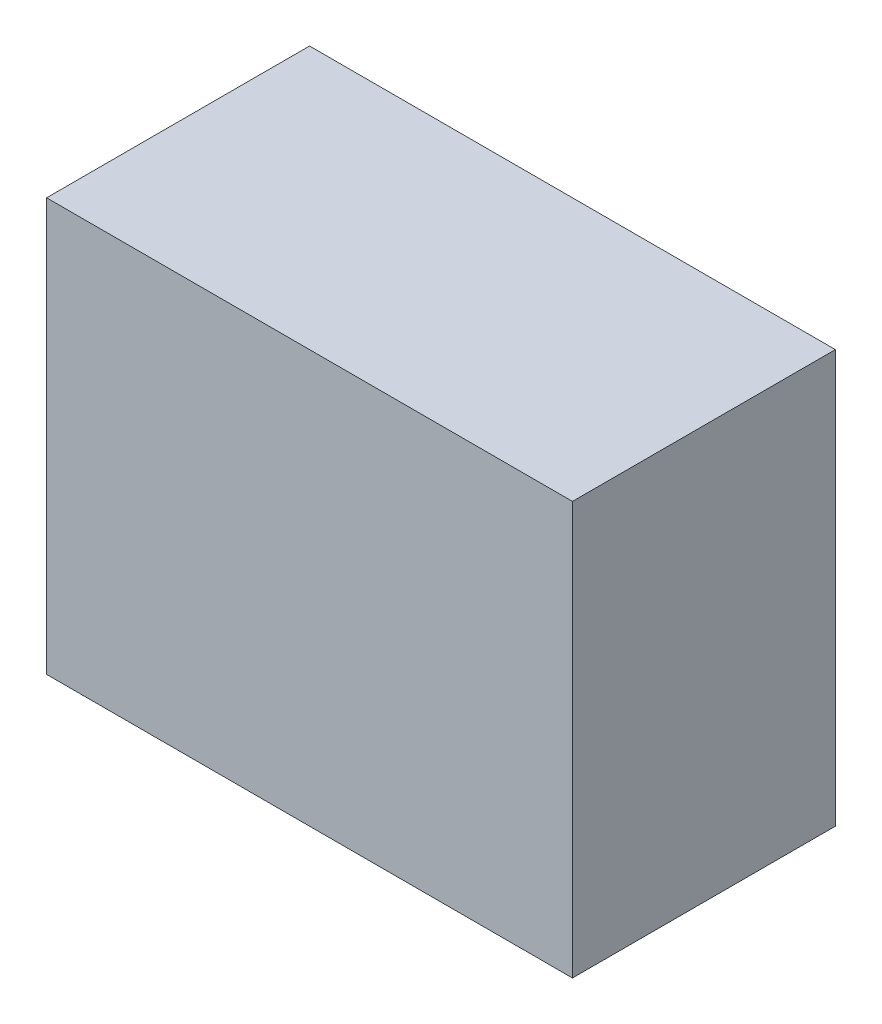
ISO-10303-21;
HEADER;
FILE_DESCRIPTION(('STEP AP214'),'2;1');
FILE_NAME('part.step','',(''),(''),'','','');
FILE_SCHEMA(('AUTOMOTIVE_DESIGN { 1 0 10303 214 1 1 1 1 }'));
ENDSEC;
DATA;
#1=APPLICATION_CONTEXT('core data for automotive mechanical design processes');
#2=APPLICATION_PROTOCOL_DEFINITION('international standard','automotive_design',2000,#1);
#3=PRODUCT_CONTEXT('',#1,'mechanical');
#4=PRODUCT('Part','Part','',(#3));
#5=PRODUCT_RELATED_PRODUCT_CATEGORY('part','',(#4));
#6=PRODUCT_DEFINITION_FORMATION('','',#4);
#7=PRODUCT_DEFINITION_CONTEXT('part definition',#1,'design');
#8=PRODUCT_DEFINITION('design','',#6,#7);
#9=PRODUCT_DEFINITION_SHAPE('','',#8);
#10=(LENGTH_UNIT() NAMED_UNIT(*) SI_UNIT(.MILLI.,.METRE.));
#11=(NAMED_UNIT(*) PLANE_ANGLE_UNIT() SI_UNIT($,.RADIAN.));
#12=(NAMED_UNIT(*) SI_UNIT($,.STERADIAN.) SOLID_ANGLE_UNIT());
#13=UNCERTAINTY_MEASURE_WITH_UNIT(LENGTH_MEASURE(1.E-05),#10,'distance_accuracy_value','');
#14=(GEOMETRIC_REPRESENTATION_CONTEXT(3) GLOBAL_UNCERTAINTY_ASSIGNED_CONTEXT((#13)) GLOBAL_UNIT_ASSIGNED_CONTEXT((#10,
#11,#12)) REPRESENTATION_CONTEXT('',''));
#15=CARTESIAN_POINT('',(0.,0.,0.));
#16=DIRECTION('',(0.,0.,1.));
#17=DIRECTION('',(1.,0.,0.));
#18=AXIS2_PLACEMENT_3D('',#15,#16,#17);
#19=CARTESIAN_POINT('',(25.4,96.6711266284947,-12.7));
#20=DIRECTION('',(-1.,0.,0.));
#21=DIRECTION('',(0.,0.,1.));
#22=AXIS2_PLACEMENT_3D('',#19,#20,#21);
#23=PLANE('',#22);
#24=DIRECTION('',(0.,0.,-1.));
#25=VECTOR('',#24,1.);
#26=CARTESIAN_POINT('',(25.4,39.875,-12.7));
#27=LINE('',#26,#25);
#28=CARTESIAN_POINT('',(25.4,39.875,12.7000000000001));
#29=VERTEX_POINT('',#28);
#30=CARTESIAN_POINT('',(25.4,39.875,-12.7));
#31=VERTEX_POINT('',#30);
#32=EDGE_CURVE('E102',#29,#31,#27,.T.);
#33=ORIENTED_EDGE('',*,*,#32,.F.);
#34=DIRECTION('',(0.,-1.,0.));
#35=VECTOR('',#34,1.);
#36=CARTESIAN_POINT('',(25.4,96.6711266284947,12.7));
#37=LINE('',#36,#35);
#38=CARTESIAN_POINT('',(25.4,0.,12.7));
#39=VERTEX_POINT('',#38);
#40=EDGE_CURVE('E92',#29,#39,#37,.T.);
#41=ORIENTED_EDGE('',*,*,#40,.T.);
#42=DIRECTION('',(0.,0.,-1.));
#43=VECTOR('',#42,1.);
#44=CARTESIAN_POINT('',(25.4,0.,-12.7));
#45=LINE('',#44,#43);
#46=CARTESIAN_POINT('',(25.4,0.,-12.7));
#47=VERTEX_POINT('',#46);
#48=EDGE_CURVE('E83',#39,#47,#45,.T.);
#49=ORIENTED_EDGE('',*,*,#48,.T.);
#50=DIRECTION('',(0.,-1.,0.));
#51=VECTOR('',#50,1.);
#52=CARTESIAN_POINT('',(25.4,96.6711266284947,-12.7));
#53=LINE('',#52,#51);
#54=EDGE_CURVE('E74',#31,#47,#53,.T.);
#55=ORIENTED_EDGE('',*,*,#54,.F.);
#56=EDGE_LOOP('',(#33,#41,#49,#55));
#57=FACE_BOUND('',#56,.T.);
#58=ADVANCED_FACE('F33',(#57),#23,.F.);
#59=CARTESIAN_POINT('',(-25.4,96.6711266284947,-12.7));
#60=DIRECTION('',(0.,0.,1.));
#61=DIRECTION('',(1.,0.,0.));
#62=AXIS2_PLACEMENT_3D('',#59,#60,#61);
#63=PLANE('',#62);
#64=DIRECTION('',(-1.,0.,0.));
#65=VECTOR('',#64,1.);
#66=CARTESIAN_POINT('',(-25.4,39.875,-12.7));
#67=LINE('',#66,#65);
#68=CARTESIAN_POINT('',(-25.4,39.875,-12.7));
#69=VERTEX_POINT('',#68);
#70=EDGE_CURVE('E80',#31,#69,#67,.T.);
#71=ORIENTED_EDGE('',*,*,#70,.F.);
#72=ORIENTED_EDGE('',*,*,#54,.T.);
#73=DIRECTION('',(-1.,0.,0.));
#74=VECTOR('',#73,1.);
#75=CARTESIAN_POINT('',(-25.4,0.,-12.7));
#76=LINE('',#75,#74);
#77=CARTESIAN_POINT('',(-25.4,0.,-12.7));
#78=VERTEX_POINT('',#77);
#79=EDGE_CURVE('E77',#47,#78,#76,.T.);
#80=ORIENTED_EDGE('',*,*,#79,.T.);
#81=DIRECTION('',(0.,-1.,0.));
#82=VECTOR('',#81,1.);
#83=CARTESIAN_POINT('',(-25.4,96.6711266284947,-12.7));
#84=LINE('',#83,#82);
#85=EDGE_CURVE('E68',#69,#78,#84,.T.);
#86=ORIENTED_EDGE('',*,*,#85,.F.);
#87=EDGE_LOOP('',(#71,#72,#80,#86));
#88=FACE_BOUND('',#87,.T.);
#89=ADVANCED_FACE('F76',(#88),#63,.F.);
#90=CARTESIAN_POINT('',(-25.4,96.6711266284947,-12.7));
#91=DIRECTION('',(1.,0.,0.));
#92=DIRECTION('',(0.,0.,-1.));
#93=AXIS2_PLACEMENT_3D('',#90,#91,#92);
#94=PLANE('',#93);
#95=DIRECTION('',(0.,0.,1.));
#96=VECTOR('',#95,1.);
#97=CARTESIAN_POINT('',(-25.4,39.875,-12.7));
#98=LINE('',#97,#96);
#99=CARTESIAN_POINT('',(-25.4,39.875,12.7));
#100=VERTEX_POINT('',#99);
#101=EDGE_CURVE('E37',#69,#100,#98,.T.);
#102=ORIENTED_EDGE('',*,*,#101,.F.);
#103=ORIENTED_EDGE('',*,*,#85,.T.);
#104=DIRECTION('',(0.,0.,1.));
#105=VECTOR('',#104,1.);
#106=CARTESIAN_POINT('',(-25.4,0.,-12.7));
#107=LINE('',#106,#105);
#108=CARTESIAN_POINT('',(-25.4,0.,12.7));
#109=VERTEX_POINT('',#108);
#110=EDGE_CURVE('E89',#78,#109,#107,.T.);
#111=ORIENTED_EDGE('',*,*,#110,.T.);
#112=DIRECTION('',(0.,-1.,0.));
#113=VECTOR('',#112,1.);
#114=CARTESIAN_POINT('',(-25.4,96.6711266284947,12.7));
#115=LINE('',#114,#113);
#116=EDGE_CURVE('E99',#100,#109,#115,.T.);
#117=ORIENTED_EDGE('',*,*,#116,.F.);
#118=EDGE_LOOP('',(#102,#103,#111,#117));
#119=FACE_BOUND('',#118,.T.);
#120=ADVANCED_FACE('F104',(#119),#94,.F.);
#121=CARTESIAN_POINT('',(-25.4,96.6711266284947,12.7));
#122=DIRECTION('',(0.,0.,-1.));
#123=DIRECTION('',(-1.,0.,0.));
#124=AXIS2_PLACEMENT_3D('',#121,#122,#123);
#125=PLANE('',#124);
#126=DIRECTION('',(1.,0.,0.));
#127=VECTOR('',#126,1.);
#128=CARTESIAN_POINT('',(-25.4,39.875,12.7));
#129=LINE('',#128,#127);
#130=EDGE_CURVE('E11',#100,#29,#129,.T.);
#131=ORIENTED_EDGE('',*,*,#130,.F.);
#132=ORIENTED_EDGE('',*,*,#116,.T.);
#133=DIRECTION('',(1.,0.,0.));
#134=VECTOR('',#133,1.);
#135=CARTESIAN_POINT('',(-25.4,0.,12.7));
#136=LINE('',#135,#134);
#137=EDGE_CURVE('E100',#109,#39,#136,.T.);
#138=ORIENTED_EDGE('',*,*,#137,.T.);
#139=ORIENTED_EDGE('',*,*,#40,.F.);
#140=EDGE_LOOP('',(#131,#132,#138,#139));
#141=FACE_BOUND('',#140,.T.);
#142=ADVANCED_FACE('F106',(#141),#125,.F.);
#143=CARTESIAN_POINT('',(0.,0.,0.));
#144=DIRECTION('',(0.,1.,0.));
#145=DIRECTION('',(0.,0.,1.));
#146=AXIS2_PLACEMENT_3D('',#143,#144,#145);
#147=PLANE('',#146);
#148=ORIENTED_EDGE('',*,*,#48,.F.);
#149=ORIENTED_EDGE('',*,*,#137,.F.);
#150=ORIENTED_EDGE('',*,*,#110,.F.);
#151=ORIENTED_EDGE('',*,*,#79,.F.);
#152=EDGE_LOOP('',(#148,#149,#150,#151));
#153=FACE_BOUND('',#152,.T.);
#154=ADVANCED_FACE('F87',(#153),#147,.F.);
#155=CARTESIAN_POINT('',(0.,39.875,-85.725));
#156=DIRECTION('',(0.,1.,0.));
#157=DIRECTION('',(-1.,0.,0.));
#158=AXIS2_PLACEMENT_3D('',#155,#156,#157);
#159=PLANE('',#158);
#160=ORIENTED_EDGE('',*,*,#32,.T.);
#161=ORIENTED_EDGE('',*,*,#70,.T.);
#162=ORIENTED_EDGE('',*,*,#101,.T.);
#163=ORIENTED_EDGE('',*,*,#130,.T.);
#164=EDGE_LOOP('',(#160,#161,#162,#163));
#165=FACE_BOUND('',#164,.T.);
#166=ADVANCED_FACE('F35',(#165),#159,.T.);
#167=CLOSED_SHELL('',(#58,#89,#120,#142,#154,#166));
#168=MANIFOLD_SOLID_BREP('B2',#167);
#169=ADVANCED_BREP_SHAPE_REPRESENTATION('',(#18,#168),#14);
#170=SHAPE_DEFINITION_REPRESENTATION(#9,#169);
ENDSEC;
END-ISO-10303-21;
